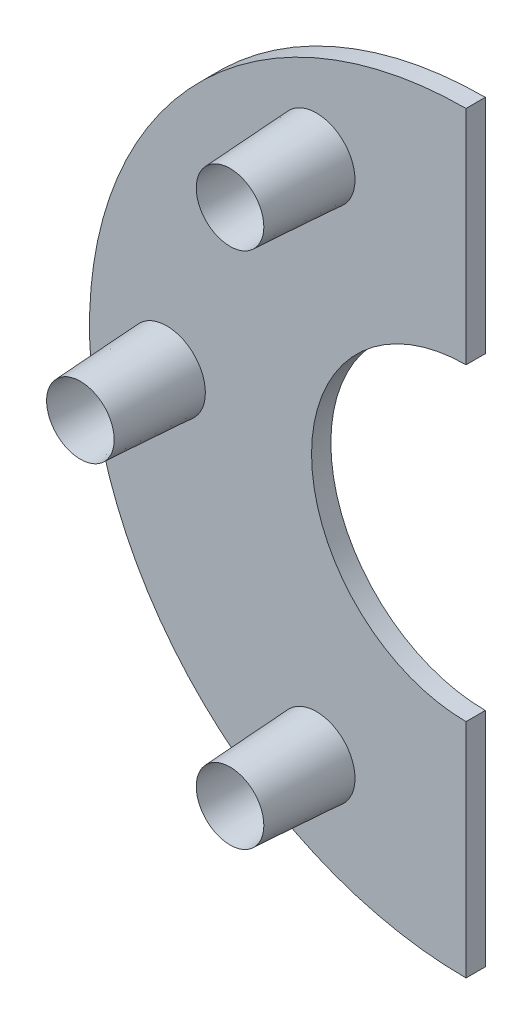
ISO-10303-21;
HEADER;
FILE_DESCRIPTION(('STEP AP214'),'2;1');
FILE_NAME('part.step','',(''),(''),'','','');
FILE_SCHEMA(('AUTOMOTIVE_DESIGN { 1 0 10303 214 1 1 1 1 }'));
ENDSEC;
DATA;
#1=APPLICATION_CONTEXT('core data for automotive mechanical design processes');
#2=APPLICATION_PROTOCOL_DEFINITION('international standard','automotive_design',2000,#1);
#3=PRODUCT_CONTEXT('',#1,'mechanical');
#4=PRODUCT('Part','Part','',(#3));
#5=PRODUCT_RELATED_PRODUCT_CATEGORY('part','',(#4));
#6=PRODUCT_DEFINITION_FORMATION('','',#4);
#7=PRODUCT_DEFINITION_CONTEXT('part definition',#1,'design');
#8=PRODUCT_DEFINITION('design','',#6,#7);
#9=PRODUCT_DEFINITION_SHAPE('','',#8);
#10=(LENGTH_UNIT() NAMED_UNIT(*) SI_UNIT(.MILLI.,.METRE.));
#11=(NAMED_UNIT(*) PLANE_ANGLE_UNIT() SI_UNIT($,.RADIAN.));
#12=(NAMED_UNIT(*) SI_UNIT($,.STERADIAN.) SOLID_ANGLE_UNIT());
#13=UNCERTAINTY_MEASURE_WITH_UNIT(LENGTH_MEASURE(1.E-05),#10,'distance_accuracy_value','');
#14=(GEOMETRIC_REPRESENTATION_CONTEXT(3) GLOBAL_UNCERTAINTY_ASSIGNED_CONTEXT((#13)) GLOBAL_UNIT_ASSIGNED_CONTEXT((#10,
#11,#12)) REPRESENTATION_CONTEXT('',''));
#15=CARTESIAN_POINT('',(0.,0.,0.));
#16=DIRECTION('',(0.,0.,1.));
#17=DIRECTION('',(1.,0.,0.));
#18=AXIS2_PLACEMENT_3D('',#15,#16,#17);
#19=CARTESIAN_POINT('',(0.,0.,0.1));
#20=DIRECTION('',(1.,0.,0.));
#21=DIRECTION('',(0.,0.,-1.));
#22=AXIS2_PLACEMENT_3D('',#19,#20,#21);
#23=PLANE('',#22);
#24=DIRECTION('',(0.,-1.,0.));
#25=VECTOR('',#24,1.);
#26=CARTESIAN_POINT('',(0.,0.,0.));
#27=LINE('',#26,#25);
#28=CARTESIAN_POINT('',(0.,1.95,0.));
#29=VERTEX_POINT('',#28);
#30=CARTESIAN_POINT('',(0.,0.8,0.));
#31=VERTEX_POINT('',#30);
#32=EDGE_CURVE('E123',#29,#31,#27,.T.);
#33=ORIENTED_EDGE('',*,*,#32,.F.);
#34=DIRECTION('',(0.,0.,-1.));
#35=VECTOR('',#34,1.);
#36=CARTESIAN_POINT('',(0.,1.95,0.1));
#37=LINE('',#36,#35);
#38=CARTESIAN_POINT('',(0.,1.95,0.1));
#39=VERTEX_POINT('',#38);
#40=EDGE_CURVE('E12',#39,#29,#37,.T.);
#41=ORIENTED_EDGE('',*,*,#40,.F.);
#42=DIRECTION('',(0.,-1.,0.));
#43=VECTOR('',#42,1.);
#44=CARTESIAN_POINT('',(0.,0.,0.1));
#45=LINE('',#44,#43);
#46=CARTESIAN_POINT('',(0.,0.8,0.1));
#47=VERTEX_POINT('',#46);
#48=EDGE_CURVE('E97',#39,#47,#45,.T.);
#49=ORIENTED_EDGE('',*,*,#48,.T.);
#50=DIRECTION('',(0.,0.,-1.));
#51=VECTOR('',#50,1.);
#52=CARTESIAN_POINT('',(0.,0.8,0.1));
#53=LINE('',#52,#51);
#54=EDGE_CURVE('E65',#47,#31,#53,.T.);
#55=ORIENTED_EDGE('',*,*,#54,.T.);
#56=EDGE_LOOP('',(#33,#41,#49,#55));
#57=FACE_BOUND('',#56,.T.);
#58=ADVANCED_FACE('F47',(#57),#23,.T.);
#59=CARTESIAN_POINT('',(0.,0.,0.1));
#60=DIRECTION('',(0.,0.,-1.));
#61=DIRECTION('',(-1.,0.,0.));
#62=AXIS2_PLACEMENT_3D('',#59,#60,#61);
#63=CYLINDRICAL_SURFACE('',#62,1.95);
#64=CARTESIAN_POINT('',(0.,0.,0.));
#65=DIRECTION('',(0.,0.,1.));
#66=DIRECTION('',(1.,0.,0.));
#67=AXIS2_PLACEMENT_3D('',#64,#65,#66);
#68=CIRCLE('',#67,1.95);
#69=CARTESIAN_POINT('',(0.,-1.95,0.));
#70=VERTEX_POINT('',#69);
#71=EDGE_CURVE('E103',#29,#70,#68,.T.);
#72=ORIENTED_EDGE('',*,*,#71,.T.);
#73=DIRECTION('',(0.,0.,-1.));
#74=VECTOR('',#73,1.);
#75=CARTESIAN_POINT('',(0.,-1.95,0.1));
#76=LINE('',#75,#74);
#77=CARTESIAN_POINT('',(0.,-1.95,0.1));
#78=VERTEX_POINT('',#77);
#79=EDGE_CURVE('E57',#78,#70,#76,.T.);
#80=ORIENTED_EDGE('',*,*,#79,.F.);
#81=CARTESIAN_POINT('',(0.,0.,0.1));
#82=DIRECTION('',(0.,0.,1.));
#83=DIRECTION('',(1.,0.,0.));
#84=AXIS2_PLACEMENT_3D('',#81,#82,#83);
#85=CIRCLE('',#84,1.95);
#86=EDGE_CURVE('E91',#39,#78,#85,.T.);
#87=ORIENTED_EDGE('',*,*,#86,.F.);
#88=ORIENTED_EDGE('',*,*,#40,.T.);
#89=EDGE_LOOP('',(#72,#80,#87,#88));
#90=FACE_BOUND('',#89,.T.);
#91=ADVANCED_FACE('F49',(#90),#63,.T.);
#92=CARTESIAN_POINT('',(0.,-0.8,0.));
#93=VERTEX_POINT('',#92);
#94=EDGE_CURVE('E118',#93,#70,#27,.T.);
#95=ORIENTED_EDGE('',*,*,#94,.F.);
#96=DIRECTION('',(0.,0.,-1.));
#97=VECTOR('',#96,1.);
#98=CARTESIAN_POINT('',(0.,-0.8,0.1));
#99=LINE('',#98,#97);
#100=CARTESIAN_POINT('',(0.,-0.8,0.1));
#101=VERTEX_POINT('',#100);
#102=EDGE_CURVE('E78',#101,#93,#99,.T.);
#103=ORIENTED_EDGE('',*,*,#102,.F.);
#104=EDGE_CURVE('E96',#101,#78,#45,.T.);
#105=ORIENTED_EDGE('',*,*,#104,.T.);
#106=ORIENTED_EDGE('',*,*,#79,.T.);
#107=EDGE_LOOP('',(#95,#103,#105,#106));
#108=FACE_BOUND('',#107,.T.);
#109=ADVANCED_FACE('F107',(#108),#23,.T.);
#110=CARTESIAN_POINT('',(0.,0.,0.1));
#111=DIRECTION('',(0.,0.,-1.));
#112=DIRECTION('',(-1.,0.,0.));
#113=AXIS2_PLACEMENT_3D('',#110,#111,#112);
#114=CYLINDRICAL_SURFACE('',#113,0.8);
#115=CARTESIAN_POINT('',(0.,0.,0.));
#116=DIRECTION('',(0.,0.,1.));
#117=DIRECTION('',(1.,0.,0.));
#118=AXIS2_PLACEMENT_3D('',#115,#116,#117);
#119=CIRCLE('',#118,0.8);
#120=EDGE_CURVE('E115',#31,#93,#119,.T.);
#121=ORIENTED_EDGE('',*,*,#120,.F.);
#122=ORIENTED_EDGE('',*,*,#54,.F.);
#123=CARTESIAN_POINT('',(0.,0.,0.1));
#124=DIRECTION('',(0.,0.,1.));
#125=DIRECTION('',(1.,0.,0.));
#126=AXIS2_PLACEMENT_3D('',#123,#124,#125);
#127=CIRCLE('',#126,0.8);
#128=EDGE_CURVE('E109',#47,#101,#127,.T.);
#129=ORIENTED_EDGE('',*,*,#128,.T.);
#130=ORIENTED_EDGE('',*,*,#102,.T.);
#131=EDGE_LOOP('',(#121,#122,#129,#130));
#132=FACE_BOUND('',#131,.T.);
#133=ADVANCED_FACE('F216',(#132),#114,.F.);
#134=CARTESIAN_POINT('',(0.,0.,0.1));
#135=DIRECTION('',(0.,0.,1.));
#136=DIRECTION('',(1.,0.,0.));
#137=AXIS2_PLACEMENT_3D('',#134,#135,#136);
#138=PLANE('',#137);
#139=CARTESIAN_POINT('',(-1.55,0.,0.1));
#140=DIRECTION('',(0.,0.,1.));
#141=DIRECTION('',(1.,0.,0.));
#142=AXIS2_PLACEMENT_3D('',#139,#140,#141);
#143=CIRCLE('',#142,0.2);
#144=CARTESIAN_POINT('',(-1.35,0.,0.1));
#145=VERTEX_POINT('',#144);
#146=EDGE_CURVE('E149',#145,#145,#143,.T.);
#147=ORIENTED_EDGE('',*,*,#146,.F.);
#148=EDGE_LOOP('',(#147));
#149=FACE_BOUND('',#148,.T.);
#150=CARTESIAN_POINT('',(-0.774999999999997,1.34233937586588,0.1));
#151=DIRECTION('',(0.,0.,1.));
#152=DIRECTION('',(1.,0.,0.));
#153=AXIS2_PLACEMENT_3D('',#150,#151,#152);
#154=CIRCLE('',#153,0.2);
#155=CARTESIAN_POINT('',(-0.574999999999997,1.34233937586588,0.1));
#156=VERTEX_POINT('',#155);
#157=EDGE_CURVE('E139',#156,#156,#154,.T.);
#158=ORIENTED_EDGE('',*,*,#157,.F.);
#159=EDGE_LOOP('',(#158));
#160=FACE_BOUND('',#159,.T.);
#161=CARTESIAN_POINT('',(-0.774999999999996,-1.34233937586588,0.1));
#162=DIRECTION('',(0.,0.,1.));
#163=DIRECTION('',(1.,0.,0.));
#164=AXIS2_PLACEMENT_3D('',#161,#162,#163);
#165=CIRCLE('',#164,0.2);
#166=CARTESIAN_POINT('',(-0.574999999999996,-1.34233937586588,0.1));
#167=VERTEX_POINT('',#166);
#168=EDGE_CURVE('E134',#167,#167,#165,.T.);
#169=ORIENTED_EDGE('',*,*,#168,.F.);
#170=EDGE_LOOP('',(#169));
#171=FACE_BOUND('',#170,.T.);
#172=ORIENTED_EDGE('',*,*,#48,.F.);
#173=ORIENTED_EDGE('',*,*,#86,.T.);
#174=ORIENTED_EDGE('',*,*,#104,.F.);
#175=ORIENTED_EDGE('',*,*,#128,.F.);
#176=EDGE_LOOP('',(#172,#173,#174,#175));
#177=FACE_BOUND('',#176,.T.);
#178=ADVANCED_FACE('F93',(#149,#160,#171,#177),#138,.T.);
#179=CARTESIAN_POINT('',(0.,0.,0.));
#180=DIRECTION('',(0.,0.,1.));
#181=DIRECTION('',(1.,0.,0.));
#182=AXIS2_PLACEMENT_3D('',#179,#180,#181);
#183=PLANE('',#182);
#184=CARTESIAN_POINT('',(-0.774999999999997,1.34233937586588,0.));
#185=DIRECTION('',(0.,0.,1.));
#186=DIRECTION('',(1.,0.,0.));
#187=AXIS2_PLACEMENT_3D('',#184,#185,#186);
#188=CIRCLE('',#187,0.15);
#189=CARTESIAN_POINT('',(-0.624999999999997,1.34233937586588,0.));
#190=VERTEX_POINT('',#189);
#191=EDGE_CURVE('E157',#190,#190,#188,.T.);
#192=ORIENTED_EDGE('',*,*,#191,.T.);
#193=EDGE_LOOP('',(#192));
#194=FACE_BOUND('',#193,.T.);
#195=CARTESIAN_POINT('',(-0.774999999999996,-1.34233937586588,0.));
#196=DIRECTION('',(0.,0.,1.));
#197=DIRECTION('',(1.,0.,0.));
#198=AXIS2_PLACEMENT_3D('',#195,#196,#197);
#199=CIRCLE('',#198,0.15);
#200=CARTESIAN_POINT('',(-0.624999999999996,-1.34233937586588,0.));
#201=VERTEX_POINT('',#200);
#202=EDGE_CURVE('E170',#201,#201,#199,.T.);
#203=ORIENTED_EDGE('',*,*,#202,.T.);
#204=EDGE_LOOP('',(#203));
#205=FACE_BOUND('',#204,.T.);
#206=CARTESIAN_POINT('',(-1.55,0.,0.));
#207=DIRECTION('',(0.,0.,1.));
#208=DIRECTION('',(1.,0.,0.));
#209=AXIS2_PLACEMENT_3D('',#206,#207,#208);
#210=CIRCLE('',#209,0.15);
#211=CARTESIAN_POINT('',(-1.4,0.,0.));
#212=VERTEX_POINT('',#211);
#213=EDGE_CURVE('E162',#212,#212,#210,.T.);
#214=ORIENTED_EDGE('',*,*,#213,.T.);
#215=EDGE_LOOP('',(#214));
#216=FACE_BOUND('',#215,.T.);
#217=ORIENTED_EDGE('',*,*,#32,.T.);
#218=ORIENTED_EDGE('',*,*,#120,.T.);
#219=ORIENTED_EDGE('',*,*,#94,.T.);
#220=ORIENTED_EDGE('',*,*,#71,.F.);
#221=EDGE_LOOP('',(#217,#218,#219,#220));
#222=FACE_BOUND('',#221,.T.);
#223=ADVANCED_FACE('F182',(#194,#205,#216,#222),#183,.F.);
#224=CARTESIAN_POINT('',(-0.774999999999996,-1.34233937586588,0.1));
#225=DIRECTION('',(0.,0.,-1.));
#226=DIRECTION('',(1.,0.,0.));
#227=AXIS2_PLACEMENT_3D('',#224,#225,#226);
#228=CONICAL_SURFACE('',#227,0.2,0.0558505360638187);
#229=ORIENTED_EDGE('',*,*,#168,.T.);
#230=EDGE_LOOP('',(#229));
#231=FACE_BOUND('',#230,.T.);
#232=CARTESIAN_POINT('',(-0.774999999999996,-1.34233937586588,0.547157759497999));
#233=DIRECTION('',(0.,0.,-1.));
#234=DIRECTION('',(-1.,0.,0.));
#235=AXIS2_PLACEMENT_3D('',#232,#233,#234);
#236=CIRCLE('',#235,0.175);
#237=CARTESIAN_POINT('',(-0.949999999999996,-1.34233937586588,0.547157759497999));
#238=VERTEX_POINT('',#237);
#239=EDGE_CURVE('E131',#238,#238,#236,.T.);
#240=ORIENTED_EDGE('',*,*,#239,.T.);
#241=EDGE_LOOP('',(#240));
#242=FACE_BOUND('',#241,.T.);
#243=ADVANCED_FACE('F227',(#231,#242),#228,.T.);
#244=CARTESIAN_POINT('',(-0.774999999999996,-1.34233937586588,0.1));
#245=DIRECTION('',(0.,0.,1.));
#246=DIRECTION('',(1.,0.,0.));
#247=AXIS2_PLACEMENT_3D('',#244,#245,#246);
#248=CONICAL_SURFACE('',#247,0.15,0.0558505360638187);
#249=ORIENTED_EDGE('',*,*,#239,.F.);
#250=EDGE_LOOP('',(#249));
#251=FACE_BOUND('',#250,.T.);
#252=CARTESIAN_POINT('',(-0.774999999999996,-1.34233937586588,0.1));
#253=DIRECTION('',(0.,0.,1.));
#254=DIRECTION('',(1.,0.,0.));
#255=AXIS2_PLACEMENT_3D('',#252,#253,#254);
#256=CIRCLE('',#255,0.15);
#257=CARTESIAN_POINT('',(-0.624999999999996,-1.34233937586588,0.1));
#258=VERTEX_POINT('',#257);
#259=EDGE_CURVE('E166',#258,#258,#256,.T.);
#260=ORIENTED_EDGE('',*,*,#259,.F.);
#261=EDGE_LOOP('',(#260));
#262=FACE_BOUND('',#261,.T.);
#263=ADVANCED_FACE('F205',(#251,#262),#248,.F.);
#264=CARTESIAN_POINT('',(-0.774999999999997,1.34233937586588,0.1));
#265=DIRECTION('',(0.,0.,-1.));
#266=DIRECTION('',(1.,0.,0.));
#267=AXIS2_PLACEMENT_3D('',#264,#265,#266);
#268=CONICAL_SURFACE('',#267,0.2,0.0558505360638187);
#269=ORIENTED_EDGE('',*,*,#157,.T.);
#270=EDGE_LOOP('',(#269));
#271=FACE_BOUND('',#270,.T.);
#272=CARTESIAN_POINT('',(-0.774999999999997,1.34233937586588,0.547157759498001));
#273=DIRECTION('',(0.,0.,-1.));
#274=DIRECTION('',(-1.,0.,0.));
#275=AXIS2_PLACEMENT_3D('',#272,#273,#274);
#276=CIRCLE('',#275,0.175);
#277=CARTESIAN_POINT('',(-0.949999999999997,1.34233937586588,0.547157759498001));
#278=VERTEX_POINT('',#277);
#279=EDGE_CURVE('E145',#278,#278,#276,.T.);
#280=ORIENTED_EDGE('',*,*,#279,.T.);
#281=EDGE_LOOP('',(#280));
#282=FACE_BOUND('',#281,.T.);
#283=ADVANCED_FACE('F195',(#271,#282),#268,.T.);
#284=CARTESIAN_POINT('',(-0.774999999999997,1.34233937586588,0.1));
#285=DIRECTION('',(0.,0.,1.));
#286=DIRECTION('',(1.,0.,0.));
#287=AXIS2_PLACEMENT_3D('',#284,#285,#286);
#288=CONICAL_SURFACE('',#287,0.15,0.0558505360638187);
#289=ORIENTED_EDGE('',*,*,#279,.F.);
#290=EDGE_LOOP('',(#289));
#291=FACE_BOUND('',#290,.T.);
#292=CARTESIAN_POINT('',(-0.774999999999997,1.34233937586588,0.1));
#293=DIRECTION('',(0.,0.,1.));
#294=DIRECTION('',(1.,0.,0.));
#295=AXIS2_PLACEMENT_3D('',#292,#293,#294);
#296=CIRCLE('',#295,0.15);
#297=CARTESIAN_POINT('',(-0.624999999999997,1.34233937586588,0.1));
#298=VERTEX_POINT('',#297);
#299=EDGE_CURVE('E174',#298,#298,#296,.T.);
#300=ORIENTED_EDGE('',*,*,#299,.F.);
#301=EDGE_LOOP('',(#300));
#302=FACE_BOUND('',#301,.T.);
#303=ADVANCED_FACE('F192',(#291,#302),#288,.F.);
#304=CARTESIAN_POINT('',(-1.55,0.,0.1));
#305=DIRECTION('',(0.,0.,1.));
#306=DIRECTION('',(1.,0.,0.));
#307=AXIS2_PLACEMENT_3D('',#304,#305,#306);
#308=CONICAL_SURFACE('',#307,0.15,0.0558505360638187);
#309=CARTESIAN_POINT('',(-1.55,0.,0.1));
#310=DIRECTION('',(0.,0.,1.));
#311=DIRECTION('',(1.,0.,0.));
#312=AXIS2_PLACEMENT_3D('',#309,#310,#311);
#313=CIRCLE('',#312,0.15);
#314=CARTESIAN_POINT('',(-1.4,0.,0.1));
#315=VERTEX_POINT('',#314);
#316=EDGE_CURVE('E158',#315,#315,#313,.T.);
#317=ORIENTED_EDGE('',*,*,#316,.F.);
#318=EDGE_LOOP('',(#317));
#319=FACE_BOUND('',#318,.T.);
#320=CARTESIAN_POINT('',(-1.55,0.,0.547157759498));
#321=DIRECTION('',(0.,0.,1.));
#322=DIRECTION('',(1.,0.,0.));
#323=AXIS2_PLACEMENT_3D('',#320,#321,#322);
#324=CIRCLE('',#323,0.175);
#325=CARTESIAN_POINT('',(-1.375,0.,0.547157759498));
#326=VERTEX_POINT('',#325);
#327=EDGE_CURVE('E153',#326,#326,#324,.T.);
#328=ORIENTED_EDGE('',*,*,#327,.T.);
#329=EDGE_LOOP('',(#328));
#330=FACE_BOUND('',#329,.T.);
#331=ADVANCED_FACE('F194',(#319,#330),#308,.F.);
#332=CARTESIAN_POINT('',(-1.55,0.,0.1));
#333=DIRECTION('',(0.,0.,-1.));
#334=DIRECTION('',(1.,0.,0.));
#335=AXIS2_PLACEMENT_3D('',#332,#333,#334);
#336=CONICAL_SURFACE('',#335,0.2,0.0558505360638187);
#337=ORIENTED_EDGE('',*,*,#327,.F.);
#338=EDGE_LOOP('',(#337));
#339=FACE_BOUND('',#338,.T.);
#340=ORIENTED_EDGE('',*,*,#146,.T.);
#341=EDGE_LOOP('',(#340));
#342=FACE_BOUND('',#341,.T.);
#343=ADVANCED_FACE('F202',(#339,#342),#336,.T.);
#344=CARTESIAN_POINT('',(-1.55,0.,0.));
#345=DIRECTION('',(0.,0.,1.));
#346=DIRECTION('',(1.,0.,0.));
#347=AXIS2_PLACEMENT_3D('',#344,#345,#346);
#348=CYLINDRICAL_SURFACE('',#347,0.15);
#349=ORIENTED_EDGE('',*,*,#213,.F.);
#350=EDGE_LOOP('',(#349));
#351=FACE_BOUND('',#350,.T.);
#352=ORIENTED_EDGE('',*,*,#316,.T.);
#353=EDGE_LOOP('',(#352));
#354=FACE_BOUND('',#353,.T.);
#355=ADVANCED_FACE('F239',(#351,#354),#348,.F.);
#356=CARTESIAN_POINT('',(-0.774999999999996,-1.34233937586588,0.));
#357=DIRECTION('',(0.,0.,1.));
#358=DIRECTION('',(1.,0.,0.));
#359=AXIS2_PLACEMENT_3D('',#356,#357,#358);
#360=CYLINDRICAL_SURFACE('',#359,0.15);
#361=ORIENTED_EDGE('',*,*,#202,.F.);
#362=EDGE_LOOP('',(#361));
#363=FACE_BOUND('',#362,.T.);
#364=ORIENTED_EDGE('',*,*,#259,.T.);
#365=EDGE_LOOP('',(#364));
#366=FACE_BOUND('',#365,.T.);
#367=ADVANCED_FACE('F188',(#363,#366),#360,.F.);
#368=CARTESIAN_POINT('',(-0.774999999999997,1.34233937586588,0.));
#369=DIRECTION('',(0.,0.,1.));
#370=DIRECTION('',(1.,0.,0.));
#371=AXIS2_PLACEMENT_3D('',#368,#369,#370);
#372=CYLINDRICAL_SURFACE('',#371,0.15);
#373=ORIENTED_EDGE('',*,*,#191,.F.);
#374=EDGE_LOOP('',(#373));
#375=FACE_BOUND('',#374,.T.);
#376=ORIENTED_EDGE('',*,*,#299,.T.);
#377=EDGE_LOOP('',(#376));
#378=FACE_BOUND('',#377,.T.);
#379=ADVANCED_FACE('F185',(#375,#378),#372,.F.);
#380=CLOSED_SHELL('',(#58,#91,#109,#133,#178,#223,#243,#263,#283,#303,#331,#343,#355,#367,#379));
#381=MANIFOLD_SOLID_BREP('B2',#380);
#382=ADVANCED_BREP_SHAPE_REPRESENTATION('',(#18,#381),#14);
#383=SHAPE_DEFINITION_REPRESENTATION(#9,#382);
ENDSEC;
END-ISO-10303-21;
